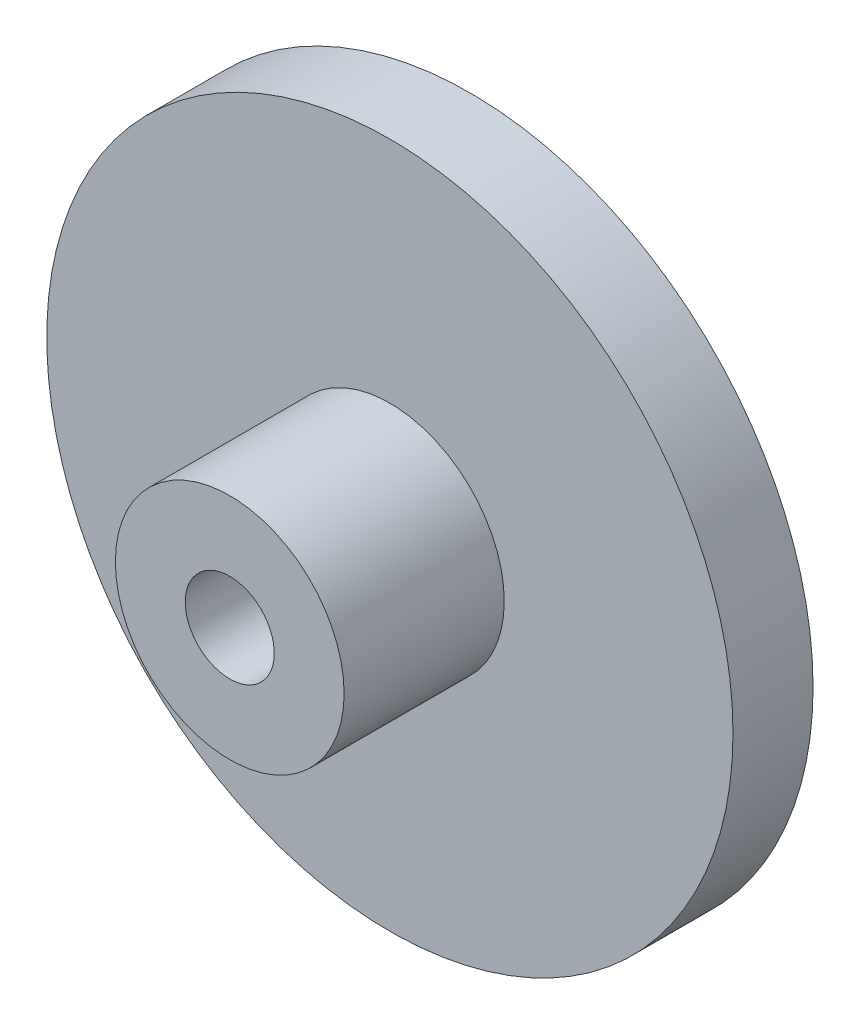
ISO-10303-21;
HEADER;
FILE_DESCRIPTION(('STEP AP214'),'2;1');
FILE_NAME('part.step','',(''),(''),'','','');
FILE_SCHEMA(('AUTOMOTIVE_DESIGN { 1 0 10303 214 1 1 1 1 }'));
ENDSEC;
DATA;
#1=APPLICATION_CONTEXT('core data for automotive mechanical design processes');
#2=APPLICATION_PROTOCOL_DEFINITION('international standard','automotive_design',2000,#1);
#3=PRODUCT_CONTEXT('',#1,'mechanical');
#4=PRODUCT('Part','Part','',(#3));
#5=PRODUCT_RELATED_PRODUCT_CATEGORY('part','',(#4));
#6=PRODUCT_DEFINITION_FORMATION('','',#4);
#7=PRODUCT_DEFINITION_CONTEXT('part definition',#1,'design');
#8=PRODUCT_DEFINITION('design','',#6,#7);
#9=PRODUCT_DEFINITION_SHAPE('','',#8);
#10=(LENGTH_UNIT() NAMED_UNIT(*) SI_UNIT(.MILLI.,.METRE.));
#11=(NAMED_UNIT(*) PLANE_ANGLE_UNIT() SI_UNIT($,.RADIAN.));
#12=(NAMED_UNIT(*) SI_UNIT($,.STERADIAN.) SOLID_ANGLE_UNIT());
#13=UNCERTAINTY_MEASURE_WITH_UNIT(LENGTH_MEASURE(1.E-05),#10,'distance_accuracy_value','');
#14=(GEOMETRIC_REPRESENTATION_CONTEXT(3) GLOBAL_UNCERTAINTY_ASSIGNED_CONTEXT((#13)) GLOBAL_UNIT_ASSIGNED_CONTEXT((#10,
#11,#12)) REPRESENTATION_CONTEXT('',''));
#15=CARTESIAN_POINT('',(0.,0.,0.));
#16=DIRECTION('',(0.,0.,1.));
#17=DIRECTION('',(1.,0.,0.));
#18=AXIS2_PLACEMENT_3D('',#15,#16,#17);
#19=CARTESIAN_POINT('',(0.,0.,3.5));
#20=DIRECTION('',(0.,0.,-1.));
#21=DIRECTION('',(-1.,0.,0.));
#22=AXIS2_PLACEMENT_3D('',#19,#20,#21);
#23=CYLINDRICAL_SURFACE('',#22,15.);
#24=CARTESIAN_POINT('',(0.,0.,3.5));
#25=DIRECTION('',(0.,0.,1.));
#26=DIRECTION('',(1.,0.,0.));
#27=AXIS2_PLACEMENT_3D('',#24,#25,#26);
#28=CIRCLE('',#27,15.);
#29=CARTESIAN_POINT('',(15.,0.,3.5));
#30=VERTEX_POINT('',#29);
#31=EDGE_CURVE('E44',#30,#30,#28,.T.);
#32=ORIENTED_EDGE('',*,*,#31,.F.);
#33=EDGE_LOOP('',(#32));
#34=FACE_BOUND('',#33,.T.);
#35=CARTESIAN_POINT('',(0.,0.,0.));
#36=DIRECTION('',(0.,0.,1.));
#37=DIRECTION('',(1.,0.,0.));
#38=AXIS2_PLACEMENT_3D('',#35,#36,#37);
#39=CIRCLE('',#38,15.);
#40=CARTESIAN_POINT('',(15.,0.,0.));
#41=VERTEX_POINT('',#40);
#42=EDGE_CURVE('E40',#41,#41,#39,.T.);
#43=ORIENTED_EDGE('',*,*,#42,.T.);
#44=EDGE_LOOP('',(#43));
#45=FACE_BOUND('',#44,.T.);
#46=ADVANCED_FACE('F37',(#34,#45),#23,.T.);
#47=CARTESIAN_POINT('',(0.,0.,3.5));
#48=DIRECTION('',(0.,0.,1.));
#49=DIRECTION('',(1.,0.,0.));
#50=AXIS2_PLACEMENT_3D('',#47,#48,#49);
#51=PLANE('',#50);
#52=CARTESIAN_POINT('',(0.,0.,3.5));
#53=DIRECTION('',(0.,0.,1.));
#54=DIRECTION('',(1.,0.,0.));
#55=AXIS2_PLACEMENT_3D('',#52,#53,#54);
#56=CIRCLE('',#55,5.);
#57=CARTESIAN_POINT('',(5.,0.,3.5));
#58=VERTEX_POINT('',#57);
#59=EDGE_CURVE('E10',#58,#58,#56,.T.);
#60=ORIENTED_EDGE('',*,*,#59,.F.);
#61=EDGE_LOOP('',(#60));
#62=FACE_BOUND('',#61,.T.);
#63=ORIENTED_EDGE('',*,*,#31,.T.);
#64=EDGE_LOOP('',(#63));
#65=FACE_BOUND('',#64,.T.);
#66=ADVANCED_FACE('F73',(#62,#65),#51,.T.);
#67=CARTESIAN_POINT('',(0.,0.,0.));
#68=DIRECTION('',(0.,0.,1.));
#69=DIRECTION('',(1.,0.,0.));
#70=AXIS2_PLACEMENT_3D('',#67,#68,#69);
#71=PLANE('',#70);
#72=CARTESIAN_POINT('',(0.,0.,0.));
#73=DIRECTION('',(0.,0.,-1.));
#74=DIRECTION('',(-1.,0.,0.));
#75=AXIS2_PLACEMENT_3D('',#72,#73,#74);
#76=CIRCLE('',#75,1.945);
#77=CARTESIAN_POINT('',(-1.945,0.,0.));
#78=VERTEX_POINT('',#77);
#79=EDGE_CURVE('E54',#78,#78,#76,.T.);
#80=ORIENTED_EDGE('',*,*,#79,.F.);
#81=EDGE_LOOP('',(#80));
#82=FACE_BOUND('',#81,.T.);
#83=ORIENTED_EDGE('',*,*,#42,.F.);
#84=EDGE_LOOP('',(#83));
#85=FACE_BOUND('',#84,.T.);
#86=ADVANCED_FACE('F69',(#82,#85),#71,.F.);
#87=CARTESIAN_POINT('',(0.,0.,10.5));
#88=DIRECTION('',(0.,0.,-1.));
#89=DIRECTION('',(-1.,0.,0.));
#90=AXIS2_PLACEMENT_3D('',#87,#88,#89);
#91=CYLINDRICAL_SURFACE('',#90,5.);
#92=CARTESIAN_POINT('',(0.,0.,10.5));
#93=DIRECTION('',(0.,0.,1.));
#94=DIRECTION('',(1.,0.,0.));
#95=AXIS2_PLACEMENT_3D('',#92,#93,#94);
#96=CIRCLE('',#95,5.);
#97=CARTESIAN_POINT('',(5.,0.,10.5));
#98=VERTEX_POINT('',#97);
#99=EDGE_CURVE('E50',#98,#98,#96,.T.);
#100=ORIENTED_EDGE('',*,*,#99,.F.);
#101=EDGE_LOOP('',(#100));
#102=FACE_BOUND('',#101,.T.);
#103=ORIENTED_EDGE('',*,*,#59,.T.);
#104=EDGE_LOOP('',(#103));
#105=FACE_BOUND('',#104,.T.);
#106=ADVANCED_FACE('F72',(#102,#105),#91,.T.);
#107=CARTESIAN_POINT('',(0.,0.,10.5));
#108=DIRECTION('',(0.,0.,1.));
#109=DIRECTION('',(1.,0.,0.));
#110=AXIS2_PLACEMENT_3D('',#107,#108,#109);
#111=PLANE('',#110);
#112=CARTESIAN_POINT('',(0.,0.,10.5));
#113=DIRECTION('',(0.,0.,-1.));
#114=DIRECTION('',(-1.,0.,0.));
#115=AXIS2_PLACEMENT_3D('',#112,#113,#114);
#116=CIRCLE('',#115,1.945);
#117=CARTESIAN_POINT('',(-1.945,0.,10.5));
#118=VERTEX_POINT('',#117);
#119=EDGE_CURVE('E53',#118,#118,#116,.T.);
#120=ORIENTED_EDGE('',*,*,#119,.T.);
#121=EDGE_LOOP('',(#120));
#122=FACE_BOUND('',#121,.T.);
#123=ORIENTED_EDGE('',*,*,#99,.T.);
#124=EDGE_LOOP('',(#123));
#125=FACE_BOUND('',#124,.T.);
#126=ADVANCED_FACE('F60',(#122,#125),#111,.T.);
#127=CARTESIAN_POINT('',(0.,0.,10.5));
#128=DIRECTION('',(0.,0.,-1.));
#129=DIRECTION('',(-1.,0.,0.));
#130=AXIS2_PLACEMENT_3D('',#127,#128,#129);
#131=CYLINDRICAL_SURFACE('',#130,1.945);
#132=CARTESIAN_POINT('',(-1.945,0.,10.5));
#133=CARTESIAN_POINT('',(-1.945,0.,10.390625));
#134=CARTESIAN_POINT('',(-1.945,0.,10.28125));
#135=CARTESIAN_POINT('',(-1.945,0.,10.0625));
#136=CARTESIAN_POINT('',(-1.945,0.,9.953125));
#137=CARTESIAN_POINT('',(-1.945,0.,9.734375));
#138=CARTESIAN_POINT('',(-1.945,0.,9.625));
#139=CARTESIAN_POINT('',(-1.945,0.,9.40625));
#140=CARTESIAN_POINT('',(-1.945,0.,9.296875));
#141=CARTESIAN_POINT('',(-1.945,0.,9.078125));
#142=CARTESIAN_POINT('',(-1.945,0.,8.96875));
#143=CARTESIAN_POINT('',(-1.945,0.,8.75));
#144=CARTESIAN_POINT('',(-1.945,0.,8.640625));
#145=CARTESIAN_POINT('',(-1.945,0.,8.421875));
#146=CARTESIAN_POINT('',(-1.945,0.,8.3125));
#147=CARTESIAN_POINT('',(-1.945,0.,8.09375));
#148=CARTESIAN_POINT('',(-1.945,0.,7.984375));
#149=CARTESIAN_POINT('',(-1.945,0.,7.765625));
#150=CARTESIAN_POINT('',(-1.945,0.,7.65625));
#151=CARTESIAN_POINT('',(-1.945,0.,7.4375));
#152=CARTESIAN_POINT('',(-1.945,0.,7.328125));
#153=CARTESIAN_POINT('',(-1.945,0.,7.109375));
#154=CARTESIAN_POINT('',(-1.945,0.,7.));
#155=CARTESIAN_POINT('',(-1.945,0.,6.78125));
#156=CARTESIAN_POINT('',(-1.945,0.,6.671875));
#157=CARTESIAN_POINT('',(-1.945,0.,6.453125));
#158=CARTESIAN_POINT('',(-1.945,0.,6.34375));
#159=CARTESIAN_POINT('',(-1.945,0.,6.125));
#160=CARTESIAN_POINT('',(-1.945,0.,6.015625));
#161=CARTESIAN_POINT('',(-1.945,0.,5.796875));
#162=CARTESIAN_POINT('',(-1.945,0.,5.6875));
#163=CARTESIAN_POINT('',(-1.945,0.,5.46875));
#164=CARTESIAN_POINT('',(-1.945,0.,5.359375));
#165=CARTESIAN_POINT('',(-1.945,0.,5.140625));
#166=CARTESIAN_POINT('',(-1.945,0.,5.03125));
#167=CARTESIAN_POINT('',(-1.945,0.,4.8125));
#168=CARTESIAN_POINT('',(-1.945,0.,4.703125));
#169=CARTESIAN_POINT('',(-1.945,0.,4.484375));
#170=CARTESIAN_POINT('',(-1.945,0.,4.375));
#171=CARTESIAN_POINT('',(-1.945,0.,4.15625));
#172=CARTESIAN_POINT('',(-1.945,0.,4.046875));
#173=CARTESIAN_POINT('',(-1.945,0.,3.828125));
#174=CARTESIAN_POINT('',(-1.945,0.,3.71875));
#175=CARTESIAN_POINT('',(-1.945,0.,3.5));
#176=CARTESIAN_POINT('',(-1.945,0.,3.390625));
#177=CARTESIAN_POINT('',(-1.945,0.,3.171875));
#178=CARTESIAN_POINT('',(-1.945,0.,3.0625));
#179=CARTESIAN_POINT('',(-1.945,0.,2.84375));
#180=CARTESIAN_POINT('',(-1.945,0.,2.734375));
#181=CARTESIAN_POINT('',(-1.945,0.,2.515625));
#182=CARTESIAN_POINT('',(-1.945,0.,2.40625));
#183=CARTESIAN_POINT('',(-1.945,0.,2.1875));
#184=CARTESIAN_POINT('',(-1.945,0.,2.078125));
#185=CARTESIAN_POINT('',(-1.945,0.,1.859375));
#186=CARTESIAN_POINT('',(-1.945,0.,1.75));
#187=CARTESIAN_POINT('',(-1.945,0.,1.53125));
#188=CARTESIAN_POINT('',(-1.945,0.,1.421875));
#189=CARTESIAN_POINT('',(-1.945,0.,1.203125));
#190=CARTESIAN_POINT('',(-1.945,0.,1.09375));
#191=CARTESIAN_POINT('',(-1.945,0.,0.875000000000001));
#192=CARTESIAN_POINT('',(-1.945,0.,0.765625000000001));
#193=CARTESIAN_POINT('',(-1.945,0.,0.546875));
#194=CARTESIAN_POINT('',(-1.945,0.,0.4375));
#195=CARTESIAN_POINT('',(-1.945,0.,0.21875));
#196=CARTESIAN_POINT('',(-1.945,0.,0.109375));
#197=CARTESIAN_POINT('',(-1.945,0.,0.));
#198=B_SPLINE_CURVE_WITH_KNOTS('',3,(#132,#133,#134,#135,#136,#137,#138,#139,#140,#141,#142,
#143,#144,#145,#146,#147,#148,#149,#150,#151,#152,#153,#154,#155,#156,#157,#158,#159,#160,#161,
#162,#163,#164,#165,#166,#167,#168,#169,#170,#171,#172,#173,#174,#175,#176,#177,#178,#179,#180,
#181,#182,#183,#184,#185,#186,#187,#188,#189,#190,#191,#192,#193,#194,#195,#196,#197),
.UNSPECIFIED.,.F.,.F.,(4,2,2,2,2,2,2,2,2,2,2,2,2,2,2,2,2,2,2,2,2,2,2,2,2,2,2,2,2,2,2,2,4),(0.,
0.328124999999999,0.656249999999999,0.984374999999999,1.3125,1.640625,1.96875,2.296875,2.625,
2.953125,3.28125,3.609375,3.9375,4.265625,4.59375,4.921875,5.25,5.578125,5.90625,6.234375,
6.5625,6.890625,7.21875,7.546875,7.875,8.203125,8.53125,8.859375,9.1875,9.515625,9.84375,
10.171875,10.5),.UNSPECIFIED.);
#199=EDGE_CURVE('BSEAM63',#118,#78,#198,.T.);
#200=ORIENTED_EDGE('',*,*,#119,.F.);
#201=ORIENTED_EDGE('',*,*,#79,.T.);
#202=ORIENTED_EDGE('',*,*,#199,.T.);
#203=ORIENTED_EDGE('',*,*,#199,.F.);
#204=EDGE_LOOP('',(#200,#202,#201,#203));
#205=FACE_BOUND('',#204,.T.);
#206=ADVANCED_FACE('F63',(#205),#131,.F.);
#207=CLOSED_SHELL('',(#46,#66,#86,#106,#126,#206));
#208=MANIFOLD_SOLID_BREP('B2',#207);
#209=ADVANCED_BREP_SHAPE_REPRESENTATION('',(#18,#208),#14);
#210=SHAPE_DEFINITION_REPRESENTATION(#9,#209);
ENDSEC;
END-ISO-10303-21;
